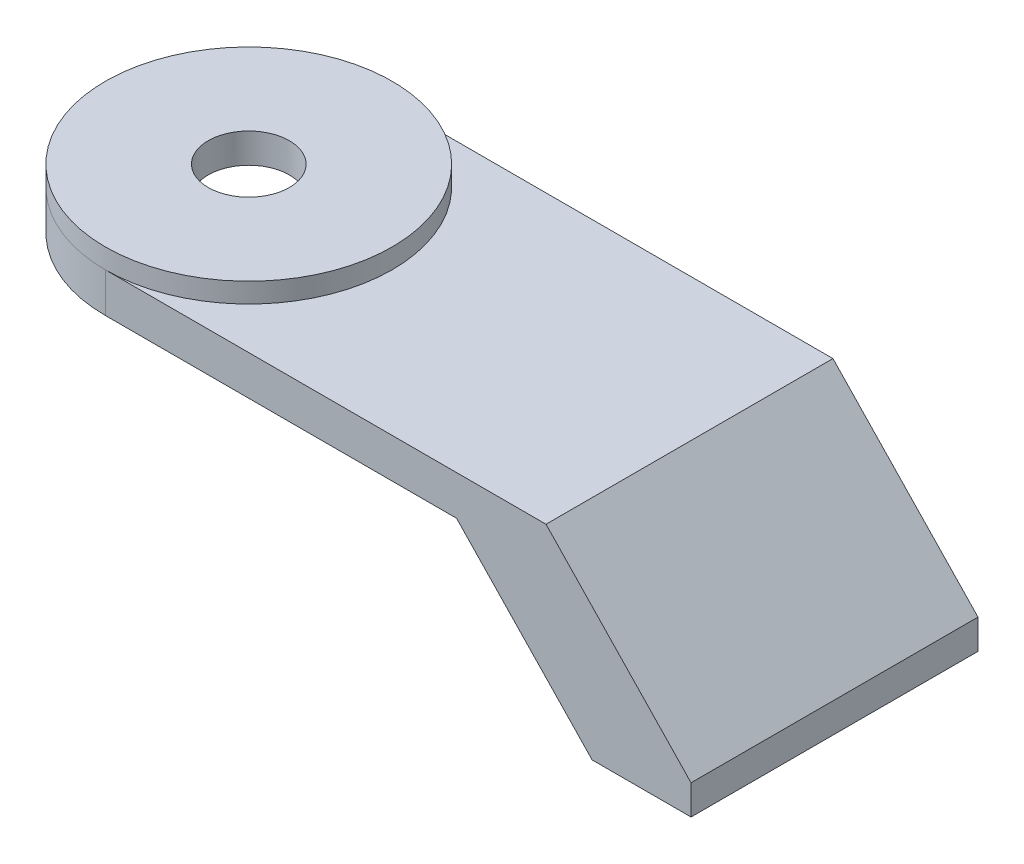
ISO-10303-21;
HEADER;
FILE_DESCRIPTION(('STEP AP214'),'2;1');
FILE_NAME('part.step','',(''),(''),'','','');
FILE_SCHEMA(('AUTOMOTIVE_DESIGN { 1 0 10303 214 1 1 1 1 }'));
ENDSEC;
DATA;
#1=APPLICATION_CONTEXT('core data for automotive mechanical design processes');
#2=APPLICATION_PROTOCOL_DEFINITION('international standard','automotive_design',2000,#1);
#3=PRODUCT_CONTEXT('',#1,'mechanical');
#4=PRODUCT('Part','Part','',(#3));
#5=PRODUCT_RELATED_PRODUCT_CATEGORY('part','',(#4));
#6=PRODUCT_DEFINITION_FORMATION('','',#4);
#7=PRODUCT_DEFINITION_CONTEXT('part definition',#1,'design');
#8=PRODUCT_DEFINITION('design','',#6,#7);
#9=PRODUCT_DEFINITION_SHAPE('','',#8);
#10=(LENGTH_UNIT() NAMED_UNIT(*) SI_UNIT(.MILLI.,.METRE.));
#11=(NAMED_UNIT(*) PLANE_ANGLE_UNIT() SI_UNIT($,.RADIAN.));
#12=(NAMED_UNIT(*) SI_UNIT($,.STERADIAN.) SOLID_ANGLE_UNIT());
#13=UNCERTAINTY_MEASURE_WITH_UNIT(LENGTH_MEASURE(1.E-05),#10,'distance_accuracy_value','');
#14=(GEOMETRIC_REPRESENTATION_CONTEXT(3) GLOBAL_UNCERTAINTY_ASSIGNED_CONTEXT((#13)) GLOBAL_UNIT_ASSIGNED_CONTEXT((#10,
#11,#12)) REPRESENTATION_CONTEXT('',''));
#15=CARTESIAN_POINT('',(0.,0.,0.));
#16=DIRECTION('',(0.,0.,1.));
#17=DIRECTION('',(1.,0.,0.));
#18=AXIS2_PLACEMENT_3D('',#15,#16,#17);
#19=CARTESIAN_POINT('',(43.,0.,14.5));
#20=DIRECTION('',(0.,1.,0.));
#21=DIRECTION('',(-1.,0.,0.));
#22=AXIS2_PLACEMENT_3D('',#19,#20,#21);
#23=PLANE('',#22);
#24=DIRECTION('',(0.,0.,-1.));
#25=VECTOR('',#24,1.);
#26=CARTESIAN_POINT('',(10.,0.,47.6360830515618));
#27=LINE('',#26,#25);
#28=CARTESIAN_POINT('',(10.,0.,14.5));
#29=VERTEX_POINT('',#28);
#30=CARTESIAN_POINT('',(10.,0.,-14.5));
#31=VERTEX_POINT('',#30);
#32=EDGE_CURVE('E105',#29,#31,#27,.T.);
#33=ORIENTED_EDGE('',*,*,#32,.F.);
#34=DIRECTION('',(1.,0.,0.));
#35=VECTOR('',#34,1.);
#36=CARTESIAN_POINT('',(43.,0.,14.5));
#37=LINE('',#36,#35);
#38=CARTESIAN_POINT('',(0.,0.,14.5));
#39=VERTEX_POINT('',#38);
#40=EDGE_CURVE('E121',#39,#29,#37,.T.);
#41=ORIENTED_EDGE('',*,*,#40,.F.);
#42=DIRECTION('',(0.,0.,-1.));
#43=VECTOR('',#42,1.);
#44=CARTESIAN_POINT('',(0.,0.,14.5));
#45=LINE('',#44,#43);
#46=CARTESIAN_POINT('',(0.,0.,-14.5));
#47=VERTEX_POINT('',#46);
#48=EDGE_CURVE('E120',#39,#47,#45,.T.);
#49=ORIENTED_EDGE('',*,*,#48,.T.);
#50=DIRECTION('',(1.,0.,0.));
#51=VECTOR('',#50,1.);
#52=CARTESIAN_POINT('',(43.,0.,-14.5));
#53=LINE('',#52,#51);
#54=EDGE_CURVE('E141',#47,#31,#53,.T.);
#55=ORIENTED_EDGE('',*,*,#54,.T.);
#56=EDGE_LOOP('',(#33,#41,#49,#55));
#57=FACE_BOUND('',#56,.T.);
#58=ADVANCED_FACE('F36',(#57),#23,.F.);
#59=CARTESIAN_POINT('',(0.,0.,-14.5));
#60=DIRECTION('',(0.,0.,1.));
#61=DIRECTION('',(1.,0.,0.));
#62=AXIS2_PLACEMENT_3D('',#59,#60,#61);
#63=PLANE('',#62);
#64=DIRECTION('',(0.,-1.,0.));
#65=VECTOR('',#64,1.);
#66=CARTESIAN_POINT('',(10.,3.,-14.5));
#67=LINE('',#66,#65);
#68=CARTESIAN_POINT('',(10.,3.,-14.5));
#69=VERTEX_POINT('',#68);
#70=EDGE_CURVE('E99',#69,#31,#67,.T.);
#71=ORIENTED_EDGE('',*,*,#70,.T.);
#72=ORIENTED_EDGE('',*,*,#54,.F.);
#73=DIRECTION('',(0.691795680606233,-0.722093301654681,0.));
#74=VECTOR('',#73,1.);
#75=CARTESIAN_POINT('',(0.,0.,-14.5));
#76=LINE('',#75,#74);
#77=CARTESIAN_POINT('',(-13.7,14.3,-14.5));
#78=VERTEX_POINT('',#77);
#79=EDGE_CURVE('E139',#78,#47,#76,.T.);
#80=ORIENTED_EDGE('',*,*,#79,.F.);
#81=DIRECTION('',(1.,0.,0.));
#82=VECTOR('',#81,1.);
#83=CARTESIAN_POINT('',(-13.7,14.3,-14.5));
#84=LINE('',#83,#82);
#85=CARTESIAN_POINT('',(-49.2,14.3,-14.5));
#86=VERTEX_POINT('',#85);
#87=EDGE_CURVE('E130',#86,#78,#84,.T.);
#88=ORIENTED_EDGE('',*,*,#87,.F.);
#89=DIRECTION('',(0.,-1.,0.));
#90=VECTOR('',#89,1.);
#91=CARTESIAN_POINT('',(-49.2,0.,-14.5));
#92=LINE('',#91,#90);
#93=CARTESIAN_POINT('',(-49.2,18.3,-14.5));
#94=VERTEX_POINT('',#93);
#95=EDGE_CURVE('E45',#86,#94,#92,.F.);
#96=ORIENTED_EDGE('',*,*,#95,.T.);
#97=DIRECTION('',(-1.,0.,0.));
#98=VECTOR('',#97,1.);
#99=CARTESIAN_POINT('',(-63.7,18.3,-14.5));
#100=LINE('',#99,#98);
#101=CARTESIAN_POINT('',(-4.65804195804196,18.3,-14.5));
#102=VERTEX_POINT('',#101);
#103=EDGE_CURVE('E126',#102,#94,#100,.T.);
#104=ORIENTED_EDGE('',*,*,#103,.F.);
#105=DIRECTION('',(-0.691795680606234,0.722093301654681,0.));
#106=VECTOR('',#105,1.);
#107=CARTESIAN_POINT('',(-4.65804195804196,18.3,-14.5));
#108=LINE('',#107,#106);
#109=EDGE_CURVE('E117',#69,#102,#108,.T.);
#110=ORIENTED_EDGE('',*,*,#109,.F.);
#111=EDGE_LOOP('',(#71,#72,#80,#88,#96,#104,#110));
#112=FACE_BOUND('',#111,.T.);
#113=ADVANCED_FACE('F123',(#112),#63,.F.);
#114=CARTESIAN_POINT('',(-49.2,2.70344878854061,0.));
#115=DIRECTION('',(0.,1.,0.));
#116=DIRECTION('',(0.,0.,1.));
#117=AXIS2_PLACEMENT_3D('',#114,#115,#116);
#118=CYLINDRICAL_SURFACE('',#117,4.1);
#119=CARTESIAN_POINT('',(-49.2,20.3,0.));
#120=DIRECTION('',(0.,1.,0.));
#121=DIRECTION('',(0.,0.,1.));
#122=AXIS2_PLACEMENT_3D('',#119,#120,#121);
#123=CIRCLE('',#122,4.1);
#124=CARTESIAN_POINT('',(-49.2,20.3,4.1));
#125=VERTEX_POINT('',#124);
#126=EDGE_CURVE('E133',#125,#125,#123,.F.);
#127=ORIENTED_EDGE('',*,*,#126,.F.);
#128=EDGE_LOOP('',(#127));
#129=FACE_BOUND('',#128,.T.);
#130=CARTESIAN_POINT('',(-49.2,17.3,0.));
#131=DIRECTION('',(0.,-1.,0.));
#132=DIRECTION('',(1.,0.,0.));
#133=AXIS2_PLACEMENT_3D('',#130,#131,#132);
#134=CIRCLE('',#133,4.1);
#135=CARTESIAN_POINT('',(-45.1,17.3,0.));
#136=VERTEX_POINT('',#135);
#137=EDGE_CURVE('E151',#136,#136,#134,.F.);
#138=ORIENTED_EDGE('',*,*,#137,.F.);
#139=EDGE_LOOP('',(#138));
#140=FACE_BOUND('',#139,.T.);
#141=ADVANCED_FACE('F214',(#129,#140),#118,.F.);
#142=CARTESIAN_POINT('',(-63.7,18.3,14.5));
#143=DIRECTION('',(0.,-1.,0.));
#144=DIRECTION('',(1.,0.,0.));
#145=AXIS2_PLACEMENT_3D('',#142,#143,#144);
#146=PLANE('',#145);
#147=CARTESIAN_POINT('',(-49.2,18.3,0.));
#148=DIRECTION('',(0.,1.,0.));
#149=DIRECTION('',(0.,0.,1.));
#150=AXIS2_PLACEMENT_3D('',#147,#148,#149);
#151=CIRCLE('',#150,14.5);
#152=CARTESIAN_POINT('',(-49.2,18.3,14.5));
#153=VERTEX_POINT('',#152);
#154=EDGE_CURVE('E154',#153,#94,#151,.T.);
#155=ORIENTED_EDGE('',*,*,#154,.F.);
#156=DIRECTION('',(-1.,0.,0.));
#157=VECTOR('',#156,1.);
#158=CARTESIAN_POINT('',(-63.7,18.3,14.5));
#159=LINE('',#158,#157);
#160=CARTESIAN_POINT('',(-4.65804195804196,18.3,14.5));
#161=VERTEX_POINT('',#160);
#162=EDGE_CURVE('E178',#161,#153,#159,.T.);
#163=ORIENTED_EDGE('',*,*,#162,.F.);
#164=DIRECTION('',(0.,0.,-1.));
#165=VECTOR('',#164,1.);
#166=CARTESIAN_POINT('',(-4.65804195804196,18.3,14.5));
#167=LINE('',#166,#165);
#168=EDGE_CURVE('E148',#161,#102,#167,.T.);
#169=ORIENTED_EDGE('',*,*,#168,.T.);
#170=ORIENTED_EDGE('',*,*,#103,.T.);
#171=EDGE_LOOP('',(#155,#163,#169,#170));
#172=FACE_BOUND('',#171,.T.);
#173=ADVANCED_FACE('F168',(#172),#146,.F.);
#174=CARTESIAN_POINT('',(-4.65804195804196,18.3,14.5));
#175=DIRECTION('',(-0.722093301654681,-0.691795680606234,0.));
#176=DIRECTION('',(0.691795680606234,-0.722093301654681,0.));
#177=AXIS2_PLACEMENT_3D('',#174,#175,#176);
#178=PLANE('',#177);
#179=ORIENTED_EDGE('',*,*,#109,.T.);
#180=ORIENTED_EDGE('',*,*,#168,.F.);
#181=DIRECTION('',(-0.691795680606234,0.722093301654681,0.));
#182=VECTOR('',#181,1.);
#183=CARTESIAN_POINT('',(-4.65804195804196,18.3,14.5));
#184=LINE('',#183,#182);
#185=CARTESIAN_POINT('',(10.,3.,14.5));
#186=VERTEX_POINT('',#185);
#187=EDGE_CURVE('E119',#186,#161,#184,.T.);
#188=ORIENTED_EDGE('',*,*,#187,.F.);
#189=DIRECTION('',(0.,0.,-1.));
#190=VECTOR('',#189,1.);
#191=CARTESIAN_POINT('',(10.,3.,14.5));
#192=LINE('',#191,#190);
#193=EDGE_CURVE('E102',#186,#69,#192,.T.);
#194=ORIENTED_EDGE('',*,*,#193,.T.);
#195=EDGE_LOOP('',(#179,#180,#188,#194));
#196=FACE_BOUND('',#195,.T.);
#197=ADVANCED_FACE('F115',(#196),#178,.F.);
#198=CARTESIAN_POINT('',(-13.7,14.3,14.5));
#199=DIRECTION('',(0.,1.,0.));
#200=DIRECTION('',(-1.,0.,0.));
#201=AXIS2_PLACEMENT_3D('',#198,#199,#200);
#202=PLANE('',#201);
#203=CARTESIAN_POINT('',(-49.2,14.3,0.));
#204=DIRECTION('',(0.,-1.,0.));
#205=DIRECTION('',(1.,0.,0.));
#206=AXIS2_PLACEMENT_3D('',#203,#204,#205);
#207=CIRCLE('',#206,10.5);
#208=CARTESIAN_POINT('',(-38.7,14.3,0.));
#209=VERTEX_POINT('',#208);
#210=EDGE_CURVE('E193',#209,#209,#207,.T.);
#211=ORIENTED_EDGE('',*,*,#210,.F.);
#212=EDGE_LOOP('',(#211));
#213=FACE_BOUND('',#212,.T.);
#214=CARTESIAN_POINT('',(-49.2,14.3,0.));
#215=DIRECTION('',(0.,1.,0.));
#216=DIRECTION('',(-1.,0.,0.));
#217=AXIS2_PLACEMENT_3D('',#214,#215,#216);
#218=CIRCLE('',#217,14.5);
#219=CARTESIAN_POINT('',(-49.2,14.3,14.5));
#220=VERTEX_POINT('',#219);
#221=CARTESIAN_POINT('',(-63.7,14.3,0.));
#222=VERTEX_POINT('',#221);
#223=EDGE_CURVE('E52',#220,#222,#218,.F.);
#224=ORIENTED_EDGE('',*,*,#223,.T.);
#225=CARTESIAN_POINT('',(-49.2,14.3,0.));
#226=DIRECTION('',(0.,1.,0.));
#227=DIRECTION('',(-1.,0.,0.));
#228=AXIS2_PLACEMENT_3D('',#225,#226,#227);
#229=CIRCLE('',#228,14.5);
#230=EDGE_CURVE('E157',#222,#86,#229,.F.);
#231=ORIENTED_EDGE('',*,*,#230,.T.);
#232=ORIENTED_EDGE('',*,*,#87,.T.);
#233=DIRECTION('',(0.,0.,-1.));
#234=VECTOR('',#233,1.);
#235=CARTESIAN_POINT('',(-13.7,14.3,14.5));
#236=LINE('',#235,#234);
#237=CARTESIAN_POINT('',(-13.7,14.3,14.5));
#238=VERTEX_POINT('',#237);
#239=EDGE_CURVE('E145',#238,#78,#236,.T.);
#240=ORIENTED_EDGE('',*,*,#239,.F.);
#241=DIRECTION('',(1.,0.,0.));
#242=VECTOR('',#241,1.);
#243=CARTESIAN_POINT('',(-13.7,14.3,14.5));
#244=LINE('',#243,#242);
#245=EDGE_CURVE('E180',#220,#238,#244,.T.);
#246=ORIENTED_EDGE('',*,*,#245,.F.);
#247=EDGE_LOOP('',(#224,#231,#232,#240,#246));
#248=FACE_BOUND('',#247,.T.);
#249=ADVANCED_FACE('F221',(#213,#248),#202,.F.);
#250=CARTESIAN_POINT('',(0.,0.,14.5));
#251=DIRECTION('',(0.722093301654681,0.691795680606233,0.));
#252=DIRECTION('',(-0.691795680606233,0.722093301654681,0.));
#253=AXIS2_PLACEMENT_3D('',#250,#251,#252);
#254=PLANE('',#253);
#255=ORIENTED_EDGE('',*,*,#79,.T.);
#256=ORIENTED_EDGE('',*,*,#48,.F.);
#257=DIRECTION('',(0.691795680606233,-0.722093301654681,0.));
#258=VECTOR('',#257,1.);
#259=CARTESIAN_POINT('',(0.,0.,14.5));
#260=LINE('',#259,#258);
#261=EDGE_CURVE('E181',#238,#39,#260,.T.);
#262=ORIENTED_EDGE('',*,*,#261,.F.);
#263=ORIENTED_EDGE('',*,*,#239,.T.);
#264=EDGE_LOOP('',(#255,#256,#262,#263));
#265=FACE_BOUND('',#264,.T.);
#266=ADVANCED_FACE('F218',(#265),#254,.F.);
#267=CARTESIAN_POINT('',(0.,0.,14.5));
#268=DIRECTION('',(0.,0.,1.));
#269=DIRECTION('',(1.,0.,0.));
#270=AXIS2_PLACEMENT_3D('',#267,#268,#269);
#271=PLANE('',#270);
#272=DIRECTION('',(0.,1.,0.));
#273=VECTOR('',#272,1.);
#274=CARTESIAN_POINT('',(10.,-34.7850542618522,14.5));
#275=LINE('',#274,#273);
#276=EDGE_CURVE('E110',#29,#186,#275,.T.);
#277=ORIENTED_EDGE('',*,*,#276,.T.);
#278=ORIENTED_EDGE('',*,*,#187,.T.);
#279=ORIENTED_EDGE('',*,*,#162,.T.);
#280=DIRECTION('',(0.,-1.,0.));
#281=VECTOR('',#280,1.);
#282=CARTESIAN_POINT('',(-49.2,14.3,14.5));
#283=LINE('',#282,#281);
#284=EDGE_CURVE('E11',#153,#220,#283,.T.);
#285=ORIENTED_EDGE('',*,*,#284,.T.);
#286=ORIENTED_EDGE('',*,*,#245,.T.);
#287=ORIENTED_EDGE('',*,*,#261,.T.);
#288=ORIENTED_EDGE('',*,*,#40,.T.);
#289=EDGE_LOOP('',(#277,#278,#279,#285,#286,#287,#288));
#290=FACE_BOUND('',#289,.T.);
#291=ADVANCED_FACE('F186',(#290),#271,.T.);
#292=CARTESIAN_POINT('',(-49.2,20.3,0.));
#293=DIRECTION('',(0.,-1.,0.));
#294=DIRECTION('',(0.,0.,-1.));
#295=AXIS2_PLACEMENT_3D('',#292,#293,#294);
#296=CYLINDRICAL_SURFACE('',#295,14.5);
#297=CARTESIAN_POINT('',(-49.2,20.3,0.));
#298=DIRECTION('',(0.,1.,0.));
#299=DIRECTION('',(0.,0.,1.));
#300=AXIS2_PLACEMENT_3D('',#297,#298,#299);
#301=CIRCLE('',#300,14.5);
#302=CARTESIAN_POINT('',(-49.2,20.3,14.5));
#303=VERTEX_POINT('',#302);
#304=EDGE_CURVE('E128',#303,#303,#301,.T.);
#305=ORIENTED_EDGE('',*,*,#304,.F.);
#306=EDGE_LOOP('',(#305));
#307=FACE_BOUND('',#306,.T.);
#308=ORIENTED_EDGE('',*,*,#154,.T.);
#309=CARTESIAN_POINT('',(-63.7,18.3,0.));
#310=VERTEX_POINT('',#309);
#311=EDGE_CURVE('E158',#94,#310,#151,.T.);
#312=ORIENTED_EDGE('',*,*,#311,.T.);
#313=EDGE_CURVE('E150',#310,#153,#151,.T.);
#314=ORIENTED_EDGE('',*,*,#313,.T.);
#315=EDGE_LOOP('',(#308,#312,#314));
#316=FACE_BOUND('',#315,.T.);
#317=ADVANCED_FACE('F171',(#307,#316),#296,.T.);
#318=CARTESIAN_POINT('',(0.,20.3,0.));
#319=DIRECTION('',(0.,1.,0.));
#320=DIRECTION('',(0.,0.,1.));
#321=AXIS2_PLACEMENT_3D('',#318,#319,#320);
#322=PLANE('',#321);
#323=ORIENTED_EDGE('',*,*,#126,.T.);
#324=EDGE_LOOP('',(#323));
#325=FACE_BOUND('',#324,.T.);
#326=ORIENTED_EDGE('',*,*,#304,.T.);
#327=EDGE_LOOP('',(#326));
#328=FACE_BOUND('',#327,.T.);
#329=ADVANCED_FACE('F256',(#325,#328),#322,.T.);
#330=CARTESIAN_POINT('',(-49.2,17.3,0.));
#331=DIRECTION('',(0.,-1.,0.));
#332=DIRECTION('',(1.,0.,0.));
#333=AXIS2_PLACEMENT_3D('',#330,#331,#332);
#334=PLANE('',#333);
#335=CARTESIAN_POINT('',(-49.2,17.3,0.));
#336=DIRECTION('',(0.,-1.,0.));
#337=DIRECTION('',(1.,0.,0.));
#338=AXIS2_PLACEMENT_3D('',#335,#336,#337);
#339=CIRCLE('',#338,10.5);
#340=CARTESIAN_POINT('',(-38.7,17.3,0.));
#341=VERTEX_POINT('',#340);
#342=EDGE_CURVE('E155',#341,#341,#339,.T.);
#343=ORIENTED_EDGE('',*,*,#342,.T.);
#344=EDGE_LOOP('',(#343));
#345=FACE_BOUND('',#344,.T.);
#346=ORIENTED_EDGE('',*,*,#137,.T.);
#347=EDGE_LOOP('',(#346));
#348=FACE_BOUND('',#347,.T.);
#349=ADVANCED_FACE('F206',(#345,#348),#334,.T.);
#350=CARTESIAN_POINT('',(-49.2,17.3,0.));
#351=DIRECTION('',(0.,-1.,0.));
#352=DIRECTION('',(1.,0.,0.));
#353=AXIS2_PLACEMENT_3D('',#350,#351,#352);
#354=CYLINDRICAL_SURFACE('',#353,10.5);
#355=ORIENTED_EDGE('',*,*,#342,.F.);
#356=EDGE_LOOP('',(#355));
#357=FACE_BOUND('',#356,.T.);
#358=ORIENTED_EDGE('',*,*,#210,.T.);
#359=EDGE_LOOP('',(#358));
#360=FACE_BOUND('',#359,.T.);
#361=ADVANCED_FACE('F201',(#357,#360),#354,.F.);
#362=CARTESIAN_POINT('',(-49.2,0.,0.));
#363=DIRECTION('',(0.,1.,0.));
#364=DIRECTION('',(0.,0.,1.));
#365=AXIS2_PLACEMENT_3D('',#362,#363,#364);
#366=CYLINDRICAL_SURFACE('',#365,14.5);
#367=ORIENTED_EDGE('',*,*,#284,.F.);
#368=ORIENTED_EDGE('',*,*,#313,.F.);
#369=DIRECTION('',(0.,-1.,0.));
#370=VECTOR('',#369,1.);
#371=CARTESIAN_POINT('',(-63.7,18.3,0.));
#372=LINE('',#371,#370);
#373=EDGE_CURVE('E40',#222,#310,#372,.F.);
#374=ORIENTED_EDGE('',*,*,#373,.F.);
#375=ORIENTED_EDGE('',*,*,#223,.F.);
#376=EDGE_LOOP('',(#367,#368,#374,#375));
#377=FACE_BOUND('',#376,.T.);
#378=ADVANCED_FACE('F38',(#377),#366,.T.);
#379=CARTESIAN_POINT('',(-49.2,14.3,0.));
#380=DIRECTION('',(0.,-1.,0.));
#381=DIRECTION('',(0.,0.,-1.));
#382=AXIS2_PLACEMENT_3D('',#379,#380,#381);
#383=CYLINDRICAL_SURFACE('',#382,14.5);
#384=ORIENTED_EDGE('',*,*,#311,.F.);
#385=ORIENTED_EDGE('',*,*,#95,.F.);
#386=ORIENTED_EDGE('',*,*,#230,.F.);
#387=ORIENTED_EDGE('',*,*,#373,.T.);
#388=EDGE_LOOP('',(#384,#385,#386,#387));
#389=FACE_BOUND('',#388,.T.);
#390=ADVANCED_FACE('F198',(#389),#383,.T.);
#391=CARTESIAN_POINT('',(10.,3.,47.6360830515618));
#392=DIRECTION('',(1.,0.,0.));
#393=DIRECTION('',(0.,0.,-1.));
#394=AXIS2_PLACEMENT_3D('',#391,#392,#393);
#395=PLANE('',#394);
#396=ORIENTED_EDGE('',*,*,#276,.F.);
#397=ORIENTED_EDGE('',*,*,#32,.T.);
#398=ORIENTED_EDGE('',*,*,#70,.F.);
#399=ORIENTED_EDGE('',*,*,#193,.F.);
#400=EDGE_LOOP('',(#396,#397,#398,#399));
#401=FACE_BOUND('',#400,.T.);
#402=ADVANCED_FACE('F101',(#401),#395,.T.);
#403=CLOSED_SHELL('',(#58,#113,#141,#173,#197,#249,#266,#291,#317,#329,#349,#361,#378,#390,#402));
#404=MANIFOLD_SOLID_BREP('B2',#403);
#405=ADVANCED_BREP_SHAPE_REPRESENTATION('',(#18,#404),#14);
#406=SHAPE_DEFINITION_REPRESENTATION(#9,#405);
ENDSEC;
END-ISO-10303-21;
